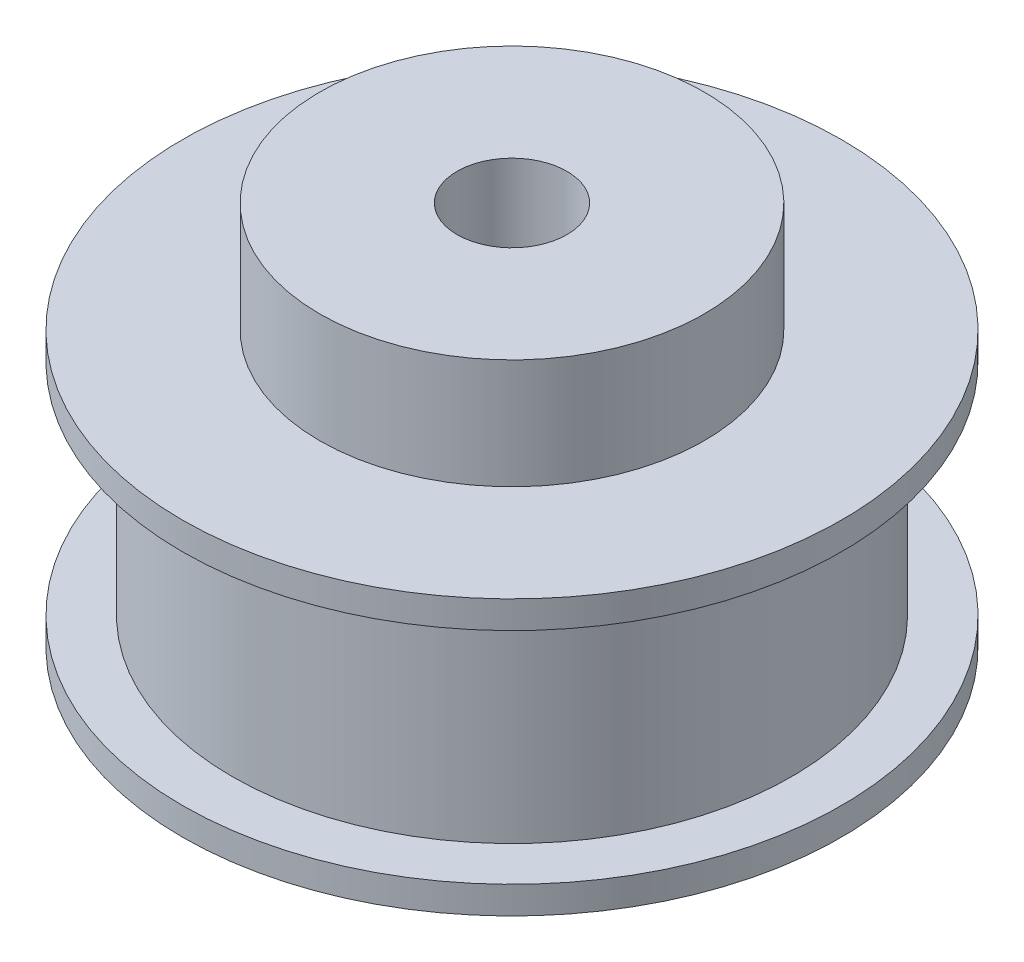
ISO-10303-21;
HEADER;
FILE_DESCRIPTION(('STEP AP214'),'2;1');
FILE_NAME('part.step','',(''),(''),'','','');
FILE_SCHEMA(('AUTOMOTIVE_DESIGN { 1 0 10303 214 1 1 1 1 }'));
ENDSEC;
DATA;
#1=APPLICATION_CONTEXT('core data for automotive mechanical design processes');
#2=APPLICATION_PROTOCOL_DEFINITION('international standard','automotive_design',2000,#1);
#3=PRODUCT_CONTEXT('',#1,'mechanical');
#4=PRODUCT('Part','Part','',(#3));
#5=PRODUCT_RELATED_PRODUCT_CATEGORY('part','',(#4));
#6=PRODUCT_DEFINITION_FORMATION('','',#4);
#7=PRODUCT_DEFINITION_CONTEXT('part definition',#1,'design');
#8=PRODUCT_DEFINITION('design','',#6,#7);
#9=PRODUCT_DEFINITION_SHAPE('','',#8);
#10=(LENGTH_UNIT() NAMED_UNIT(*) SI_UNIT(.MILLI.,.METRE.));
#11=(NAMED_UNIT(*) PLANE_ANGLE_UNIT() SI_UNIT($,.RADIAN.));
#12=(NAMED_UNIT(*) SI_UNIT($,.STERADIAN.) SOLID_ANGLE_UNIT());
#13=UNCERTAINTY_MEASURE_WITH_UNIT(LENGTH_MEASURE(1.E-05),#10,'distance_accuracy_value','');
#14=(GEOMETRIC_REPRESENTATION_CONTEXT(3) GLOBAL_UNCERTAINTY_ASSIGNED_CONTEXT((#13)) GLOBAL_UNIT_ASSIGNED_CONTEXT((#10,
#11,#12)) REPRESENTATION_CONTEXT('',''));
#15=CARTESIAN_POINT('',(0.,0.,0.));
#16=DIRECTION('',(0.,0.,1.));
#17=DIRECTION('',(1.,0.,0.));
#18=AXIS2_PLACEMENT_3D('',#15,#16,#17);
#19=CARTESIAN_POINT('',(0.,15.875,0.));
#20=DIRECTION('',(0.,1.,0.));
#21=DIRECTION('',(0.,0.,1.));
#22=AXIS2_PLACEMENT_3D('',#19,#20,#21);
#23=PLANE('',#22);
#24=CARTESIAN_POINT('',(0.,15.875,0.));
#25=DIRECTION('',(0.,1.,0.));
#26=DIRECTION('',(0.,0.,1.));
#27=AXIS2_PLACEMENT_3D('',#24,#25,#26);
#28=CIRCLE('',#27,19.05);
#29=CARTESIAN_POINT('',(0.,15.875,19.05));
#30=VERTEX_POINT('',#29);
#31=EDGE_CURVE('E46',#30,#30,#28,.T.);
#32=ORIENTED_EDGE('',*,*,#31,.T.);
#33=EDGE_LOOP('',(#32));
#34=FACE_BOUND('',#33,.T.);
#35=CARTESIAN_POINT('',(0.,15.875,0.));
#36=DIRECTION('',(0.,1.,0.));
#37=DIRECTION('',(0.,0.,1.));
#38=AXIS2_PLACEMENT_3D('',#35,#36,#37);
#39=CIRCLE('',#38,11.1125);
#40=CARTESIAN_POINT('',(0.,15.875,11.1125));
#41=VERTEX_POINT('',#40);
#42=EDGE_CURVE('E55',#41,#41,#39,.T.);
#43=ORIENTED_EDGE('',*,*,#42,.F.);
#44=EDGE_LOOP('',(#43));
#45=FACE_BOUND('',#44,.T.);
#46=ADVANCED_FACE('F30',(#34,#45),#23,.T.);
#47=CARTESIAN_POINT('',(0.,1.5875,0.));
#48=DIRECTION('',(0.,1.,0.));
#49=DIRECTION('',(0.,0.,1.));
#50=AXIS2_PLACEMENT_3D('',#47,#48,#49);
#51=PLANE('',#50);
#52=CARTESIAN_POINT('',(0.,1.5875,0.));
#53=DIRECTION('',(0.,1.,0.));
#54=DIRECTION('',(0.,0.,1.));
#55=AXIS2_PLACEMENT_3D('',#52,#53,#54);
#56=CIRCLE('',#55,19.05);
#57=CARTESIAN_POINT('',(0.,1.5875,19.05));
#58=VERTEX_POINT('',#57);
#59=EDGE_CURVE('E10',#58,#58,#56,.T.);
#60=ORIENTED_EDGE('',*,*,#59,.T.);
#61=EDGE_LOOP('',(#60));
#62=FACE_BOUND('',#61,.T.);
#63=CARTESIAN_POINT('',(0.,1.5875,0.));
#64=DIRECTION('',(0.,1.,0.));
#65=DIRECTION('',(0.,0.,1.));
#66=AXIS2_PLACEMENT_3D('',#63,#64,#65);
#67=CIRCLE('',#66,16.1671);
#68=CARTESIAN_POINT('',(0.,1.5875,16.1671));
#69=VERTEX_POINT('',#68);
#70=EDGE_CURVE('E43',#69,#69,#67,.T.);
#71=ORIENTED_EDGE('',*,*,#70,.F.);
#72=EDGE_LOOP('',(#71));
#73=FACE_BOUND('',#72,.T.);
#74=ADVANCED_FACE('F84',(#62,#73),#51,.T.);
#75=CARTESIAN_POINT('',(0.,1.5875,0.));
#76=DIRECTION('',(0.,-1.,0.));
#77=DIRECTION('',(0.,0.,-1.));
#78=AXIS2_PLACEMENT_3D('',#75,#76,#77);
#79=CYLINDRICAL_SURFACE('',#78,19.05);
#80=ORIENTED_EDGE('',*,*,#59,.F.);
#81=EDGE_LOOP('',(#80));
#82=FACE_BOUND('',#81,.T.);
#83=CARTESIAN_POINT('',(0.,0.,0.));
#84=DIRECTION('',(0.,1.,0.));
#85=DIRECTION('',(0.,0.,1.));
#86=AXIS2_PLACEMENT_3D('',#83,#84,#85);
#87=CIRCLE('',#86,19.05);
#88=CARTESIAN_POINT('',(0.,0.,19.05));
#89=VERTEX_POINT('',#88);
#90=EDGE_CURVE('E34',#89,#89,#87,.T.);
#91=ORIENTED_EDGE('',*,*,#90,.T.);
#92=EDGE_LOOP('',(#91));
#93=FACE_BOUND('',#92,.T.);
#94=ADVANCED_FACE('F32',(#82,#93),#79,.T.);
#95=CARTESIAN_POINT('',(0.,0.,0.));
#96=DIRECTION('',(0.,1.,0.));
#97=DIRECTION('',(0.,0.,1.));
#98=AXIS2_PLACEMENT_3D('',#95,#96,#97);
#99=PLANE('',#98);
#100=CARTESIAN_POINT('',(0.,0.,0.));
#101=DIRECTION('',(0.,1.,0.));
#102=DIRECTION('',(0.,0.,1.));
#103=AXIS2_PLACEMENT_3D('',#100,#101,#102);
#104=CIRCLE('',#103,3.175);
#105=CARTESIAN_POINT('',(0.,0.,3.175));
#106=VERTEX_POINT('',#105);
#107=EDGE_CURVE('E58',#106,#106,#104,.F.);
#108=ORIENTED_EDGE('',*,*,#107,.F.);
#109=EDGE_LOOP('',(#108));
#110=FACE_BOUND('',#109,.T.);
#111=ORIENTED_EDGE('',*,*,#90,.F.);
#112=EDGE_LOOP('',(#111));
#113=FACE_BOUND('',#112,.T.);
#114=ADVANCED_FACE('F101',(#110,#113),#99,.F.);
#115=CARTESIAN_POINT('',(0.,14.2875,0.));
#116=DIRECTION('',(0.,-1.,0.));
#117=DIRECTION('',(0.,0.,-1.));
#118=AXIS2_PLACEMENT_3D('',#115,#116,#117);
#119=CYLINDRICAL_SURFACE('',#118,16.1671);
#120=CARTESIAN_POINT('',(0.,14.2875,0.));
#121=DIRECTION('',(0.,1.,0.));
#122=DIRECTION('',(0.,0.,1.));
#123=AXIS2_PLACEMENT_3D('',#120,#121,#122);
#124=CIRCLE('',#123,16.1671);
#125=CARTESIAN_POINT('',(0.,14.2875,16.1671));
#126=VERTEX_POINT('',#125);
#127=EDGE_CURVE('E41',#126,#126,#124,.T.);
#128=ORIENTED_EDGE('',*,*,#127,.F.);
#129=EDGE_LOOP('',(#128));
#130=FACE_BOUND('',#129,.T.);
#131=ORIENTED_EDGE('',*,*,#70,.T.);
#132=EDGE_LOOP('',(#131));
#133=FACE_BOUND('',#132,.T.);
#134=ADVANCED_FACE('F95',(#130,#133),#119,.T.);
#135=CARTESIAN_POINT('',(0.,14.2875,0.));
#136=DIRECTION('',(0.,1.,0.));
#137=DIRECTION('',(0.,0.,1.));
#138=AXIS2_PLACEMENT_3D('',#135,#136,#137);
#139=PLANE('',#138);
#140=CARTESIAN_POINT('',(0.,14.2875,0.));
#141=DIRECTION('',(0.,1.,0.));
#142=DIRECTION('',(0.,0.,1.));
#143=AXIS2_PLACEMENT_3D('',#140,#141,#142);
#144=CIRCLE('',#143,19.05);
#145=CARTESIAN_POINT('',(0.,14.2875,19.05));
#146=VERTEX_POINT('',#145);
#147=EDGE_CURVE('E49',#146,#146,#144,.T.);
#148=ORIENTED_EDGE('',*,*,#147,.F.);
#149=EDGE_LOOP('',(#148));
#150=FACE_BOUND('',#149,.T.);
#151=ORIENTED_EDGE('',*,*,#127,.T.);
#152=EDGE_LOOP('',(#151));
#153=FACE_BOUND('',#152,.T.);
#154=ADVANCED_FACE('F92',(#150,#153),#139,.F.);
#155=CARTESIAN_POINT('',(0.,15.875,0.));
#156=DIRECTION('',(0.,-1.,0.));
#157=DIRECTION('',(0.,0.,-1.));
#158=AXIS2_PLACEMENT_3D('',#155,#156,#157);
#159=CYLINDRICAL_SURFACE('',#158,19.05);
#160=ORIENTED_EDGE('',*,*,#31,.F.);
#161=EDGE_LOOP('',(#160));
#162=FACE_BOUND('',#161,.T.);
#163=ORIENTED_EDGE('',*,*,#147,.T.);
#164=EDGE_LOOP('',(#163));
#165=FACE_BOUND('',#164,.T.);
#166=ADVANCED_FACE('F79',(#162,#165),#159,.T.);
#167=CARTESIAN_POINT('',(0.,22.225,0.));
#168=DIRECTION('',(0.,-1.,0.));
#169=DIRECTION('',(0.,0.,-1.));
#170=AXIS2_PLACEMENT_3D('',#167,#168,#169);
#171=CYLINDRICAL_SURFACE('',#170,11.1125);
#172=CARTESIAN_POINT('',(0.,22.225,0.));
#173=DIRECTION('',(0.,1.,0.));
#174=DIRECTION('',(0.,0.,1.));
#175=AXIS2_PLACEMENT_3D('',#172,#173,#174);
#176=CIRCLE('',#175,11.1125);
#177=CARTESIAN_POINT('',(0.,22.225,11.1125));
#178=VERTEX_POINT('',#177);
#179=EDGE_CURVE('E52',#178,#178,#176,.T.);
#180=ORIENTED_EDGE('',*,*,#179,.F.);
#181=EDGE_LOOP('',(#180));
#182=FACE_BOUND('',#181,.T.);
#183=ORIENTED_EDGE('',*,*,#42,.T.);
#184=EDGE_LOOP('',(#183));
#185=FACE_BOUND('',#184,.T.);
#186=ADVANCED_FACE('F73',(#182,#185),#171,.T.);
#187=CARTESIAN_POINT('',(0.,22.225,0.));
#188=DIRECTION('',(0.,1.,0.));
#189=DIRECTION('',(0.,0.,1.));
#190=AXIS2_PLACEMENT_3D('',#187,#188,#189);
#191=PLANE('',#190);
#192=CARTESIAN_POINT('',(0.,22.225,0.));
#193=DIRECTION('',(0.,1.,0.));
#194=DIRECTION('',(0.,0.,1.));
#195=AXIS2_PLACEMENT_3D('',#192,#193,#194);
#196=CIRCLE('',#195,3.175);
#197=CARTESIAN_POINT('',(0.,22.225,3.175));
#198=VERTEX_POINT('',#197);
#199=EDGE_CURVE('E63',#198,#198,#196,.T.);
#200=ORIENTED_EDGE('',*,*,#199,.F.);
#201=EDGE_LOOP('',(#200));
#202=FACE_BOUND('',#201,.T.);
#203=ORIENTED_EDGE('',*,*,#179,.T.);
#204=EDGE_LOOP('',(#203));
#205=FACE_BOUND('',#204,.T.);
#206=ADVANCED_FACE('F70',(#202,#205),#191,.T.);
#207=CARTESIAN_POINT('',(0.,-0.001000000000001,0.));
#208=DIRECTION('',(0.,1.,0.));
#209=DIRECTION('',(0.,0.,1.));
#210=AXIS2_PLACEMENT_3D('',#207,#208,#209);
#211=CYLINDRICAL_SURFACE('',#210,3.175);
#212=ORIENTED_EDGE('',*,*,#199,.T.);
#213=EDGE_LOOP('',(#212));
#214=FACE_BOUND('',#213,.T.);
#215=ORIENTED_EDGE('',*,*,#107,.T.);
#216=EDGE_LOOP('',(#215));
#217=FACE_BOUND('',#216,.T.);
#218=ADVANCED_FACE('F67',(#214,#217),#211,.F.);
#219=CLOSED_SHELL('',(#46,#74,#94,#114,#134,#154,#166,#186,#206,#218));
#220=MANIFOLD_SOLID_BREP('B2',#219);
#221=ADVANCED_BREP_SHAPE_REPRESENTATION('',(#18,#220),#14);
#222=SHAPE_DEFINITION_REPRESENTATION(#9,#221);
ENDSEC;
END-ISO-10303-21;
